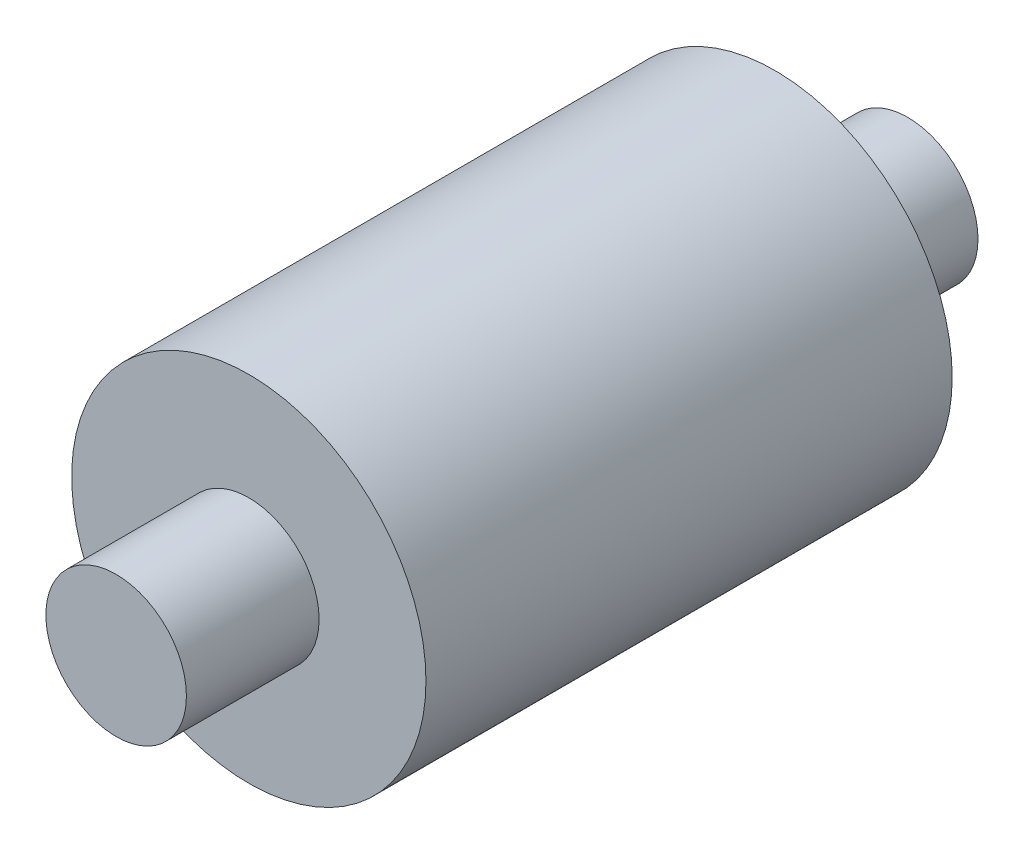
ISO-10303-21;
HEADER;
FILE_DESCRIPTION(('STEP AP214'),'2;1');
FILE_NAME('part.step','',(''),(''),'','','');
FILE_SCHEMA(('AUTOMOTIVE_DESIGN { 1 0 10303 214 1 1 1 1 }'));
ENDSEC;
DATA;
#1=APPLICATION_CONTEXT('core data for automotive mechanical design processes');
#2=APPLICATION_PROTOCOL_DEFINITION('international standard','automotive_design',2000,#1);
#3=PRODUCT_CONTEXT('',#1,'mechanical');
#4=PRODUCT('Part','Part','',(#3));
#5=PRODUCT_RELATED_PRODUCT_CATEGORY('part','',(#4));
#6=PRODUCT_DEFINITION_FORMATION('','',#4);
#7=PRODUCT_DEFINITION_CONTEXT('part definition',#1,'design');
#8=PRODUCT_DEFINITION('design','',#6,#7);
#9=PRODUCT_DEFINITION_SHAPE('','',#8);
#10=(LENGTH_UNIT() NAMED_UNIT(*) SI_UNIT(.MILLI.,.METRE.));
#11=(NAMED_UNIT(*) PLANE_ANGLE_UNIT() SI_UNIT($,.RADIAN.));
#12=(NAMED_UNIT(*) SI_UNIT($,.STERADIAN.) SOLID_ANGLE_UNIT());
#13=UNCERTAINTY_MEASURE_WITH_UNIT(LENGTH_MEASURE(1.E-05),#10,'distance_accuracy_value','');
#14=(GEOMETRIC_REPRESENTATION_CONTEXT(3) GLOBAL_UNCERTAINTY_ASSIGNED_CONTEXT((#13)) GLOBAL_UNIT_ASSIGNED_CONTEXT((#10,
#11,#12)) REPRESENTATION_CONTEXT('',''));
#15=CARTESIAN_POINT('',(0.,0.,0.));
#16=DIRECTION('',(0.,0.,1.));
#17=DIRECTION('',(1.,0.,0.));
#18=AXIS2_PLACEMENT_3D('',#15,#16,#17);
#19=CARTESIAN_POINT('',(0.,0.,-17.8816));
#20=DIRECTION('',(0.,0.,1.));
#21=DIRECTION('',(1.,0.,0.));
#22=AXIS2_PLACEMENT_3D('',#19,#20,#21);
#23=CYLINDRICAL_SURFACE('',#22,1.5875);
#24=CARTESIAN_POINT('',(0.,0.,-17.8816));
#25=DIRECTION('',(0.,0.,1.));
#26=DIRECTION('',(1.,0.,0.));
#27=AXIS2_PLACEMENT_3D('',#24,#25,#26);
#28=CIRCLE('',#27,1.5875);
#29=CARTESIAN_POINT('',(1.5875,0.,-17.8816));
#30=VERTEX_POINT('',#29);
#31=EDGE_CURVE('E46',#30,#30,#28,.T.);
#32=ORIENTED_EDGE('',*,*,#31,.T.);
#33=EDGE_LOOP('',(#32));
#34=FACE_BOUND('',#33,.T.);
#35=CARTESIAN_POINT('',(0.,0.,-14.8844));
#36=DIRECTION('',(0.,0.,1.));
#37=DIRECTION('',(1.,0.,0.));
#38=AXIS2_PLACEMENT_3D('',#35,#36,#37);
#39=CIRCLE('',#38,1.5875);
#40=CARTESIAN_POINT('',(1.5875,0.,-14.8844));
#41=VERTEX_POINT('',#40);
#42=EDGE_CURVE('E41',#41,#41,#39,.F.);
#43=ORIENTED_EDGE('',*,*,#42,.T.);
#44=EDGE_LOOP('',(#43));
#45=FACE_BOUND('',#44,.T.);
#46=ADVANCED_FACE('F37',(#34,#45),#23,.T.);
#47=CARTESIAN_POINT('',(0.,0.,-17.8816));
#48=DIRECTION('',(0.,0.,1.));
#49=DIRECTION('',(1.,0.,0.));
#50=AXIS2_PLACEMENT_3D('',#47,#48,#49);
#51=PLANE('',#50);
#52=ORIENTED_EDGE('',*,*,#31,.F.);
#53=EDGE_LOOP('',(#52));
#54=FACE_BOUND('',#53,.T.);
#55=ADVANCED_FACE('F83',(#54),#51,.F.);
#56=CARTESIAN_POINT('',(0.,0.,-14.8844));
#57=DIRECTION('',(0.,0.,1.));
#58=DIRECTION('',(1.,0.,0.));
#59=AXIS2_PLACEMENT_3D('',#56,#57,#58);
#60=CYLINDRICAL_SURFACE('',#59,4.0015);
#61=CARTESIAN_POINT('',(0.,0.,-14.8844));
#62=DIRECTION('',(0.,0.,1.));
#63=DIRECTION('',(1.,0.,0.));
#64=AXIS2_PLACEMENT_3D('',#61,#62,#63);
#65=CIRCLE('',#64,4.0015);
#66=CARTESIAN_POINT('',(4.0015,0.,-14.8844));
#67=VERTEX_POINT('',#66);
#68=EDGE_CURVE('E61',#67,#67,#65,.T.);
#69=ORIENTED_EDGE('',*,*,#68,.T.);
#70=EDGE_LOOP('',(#69));
#71=FACE_BOUND('',#70,.T.);
#72=CARTESIAN_POINT('',(0.,0.,-2.9972));
#73=DIRECTION('',(0.,0.,1.));
#74=DIRECTION('',(1.,0.,0.));
#75=AXIS2_PLACEMENT_3D('',#72,#73,#74);
#76=CIRCLE('',#75,4.0015);
#77=CARTESIAN_POINT('',(4.0015,0.,-2.9972));
#78=VERTEX_POINT('',#77);
#79=EDGE_CURVE('E57',#78,#78,#76,.T.);
#80=ORIENTED_EDGE('',*,*,#79,.F.);
#81=EDGE_LOOP('',(#80));
#82=FACE_BOUND('',#81,.T.);
#83=ADVANCED_FACE('F75',(#71,#82),#60,.T.);
#84=CARTESIAN_POINT('',(0.,0.,-14.8844));
#85=DIRECTION('',(0.,0.,1.));
#86=DIRECTION('',(1.,0.,0.));
#87=AXIS2_PLACEMENT_3D('',#84,#85,#86);
#88=PLANE('',#87);
#89=ORIENTED_EDGE('',*,*,#42,.F.);
#90=EDGE_LOOP('',(#89));
#91=FACE_BOUND('',#90,.T.);
#92=ORIENTED_EDGE('',*,*,#68,.F.);
#93=EDGE_LOOP('',(#92));
#94=FACE_BOUND('',#93,.T.);
#95=ADVANCED_FACE('F71',(#91,#94),#88,.F.);
#96=CARTESIAN_POINT('',(0.,0.,-2.9972));
#97=DIRECTION('',(0.,0.,1.));
#98=DIRECTION('',(1.,0.,0.));
#99=AXIS2_PLACEMENT_3D('',#96,#97,#98);
#100=PLANE('',#99);
#101=CARTESIAN_POINT('',(0.,0.,-2.9972));
#102=DIRECTION('',(0.,0.,1.));
#103=DIRECTION('',(1.,0.,0.));
#104=AXIS2_PLACEMENT_3D('',#101,#102,#103);
#105=CIRCLE('',#104,1.5875);
#106=CARTESIAN_POINT('',(1.5875,0.,-2.9972));
#107=VERTEX_POINT('',#106);
#108=EDGE_CURVE('E10',#107,#107,#105,.F.);
#109=ORIENTED_EDGE('',*,*,#108,.T.);
#110=EDGE_LOOP('',(#109));
#111=FACE_BOUND('',#110,.T.);
#112=ORIENTED_EDGE('',*,*,#79,.T.);
#113=EDGE_LOOP('',(#112));
#114=FACE_BOUND('',#113,.T.);
#115=ADVANCED_FACE('F74',(#111,#114),#100,.T.);
#116=CARTESIAN_POINT('',(0.,0.,0.));
#117=DIRECTION('',(0.,0.,1.));
#118=DIRECTION('',(1.,0.,0.));
#119=AXIS2_PLACEMENT_3D('',#116,#117,#118);
#120=PLANE('',#119);
#121=CARTESIAN_POINT('',(0.,0.,0.));
#122=DIRECTION('',(0.,0.,1.));
#123=DIRECTION('',(1.,0.,0.));
#124=AXIS2_PLACEMENT_3D('',#121,#122,#123);
#125=CIRCLE('',#124,1.5875);
#126=CARTESIAN_POINT('',(1.5875,0.,0.));
#127=VERTEX_POINT('',#126);
#128=EDGE_CURVE('E51',#127,#127,#125,.T.);
#129=ORIENTED_EDGE('',*,*,#128,.T.);
#130=EDGE_LOOP('',(#129));
#131=FACE_BOUND('',#130,.T.);
#132=ADVANCED_FACE('F81',(#131),#120,.T.);
#133=ORIENTED_EDGE('',*,*,#108,.F.);
#134=EDGE_LOOP('',(#133));
#135=FACE_BOUND('',#134,.T.);
#136=ORIENTED_EDGE('',*,*,#128,.F.);
#137=EDGE_LOOP('',(#136));
#138=FACE_BOUND('',#137,.T.);
#139=ADVANCED_FACE('F39',(#135,#138),#23,.T.);
#140=CLOSED_SHELL('',(#46,#55,#83,#95,#115,#132,#139));
#141=MANIFOLD_SOLID_BREP('B2',#140);
#142=ADVANCED_BREP_SHAPE_REPRESENTATION('',(#18,#141),#14);
#143=SHAPE_DEFINITION_REPRESENTATION(#9,#142);
ENDSEC;
END-ISO-10303-21;
